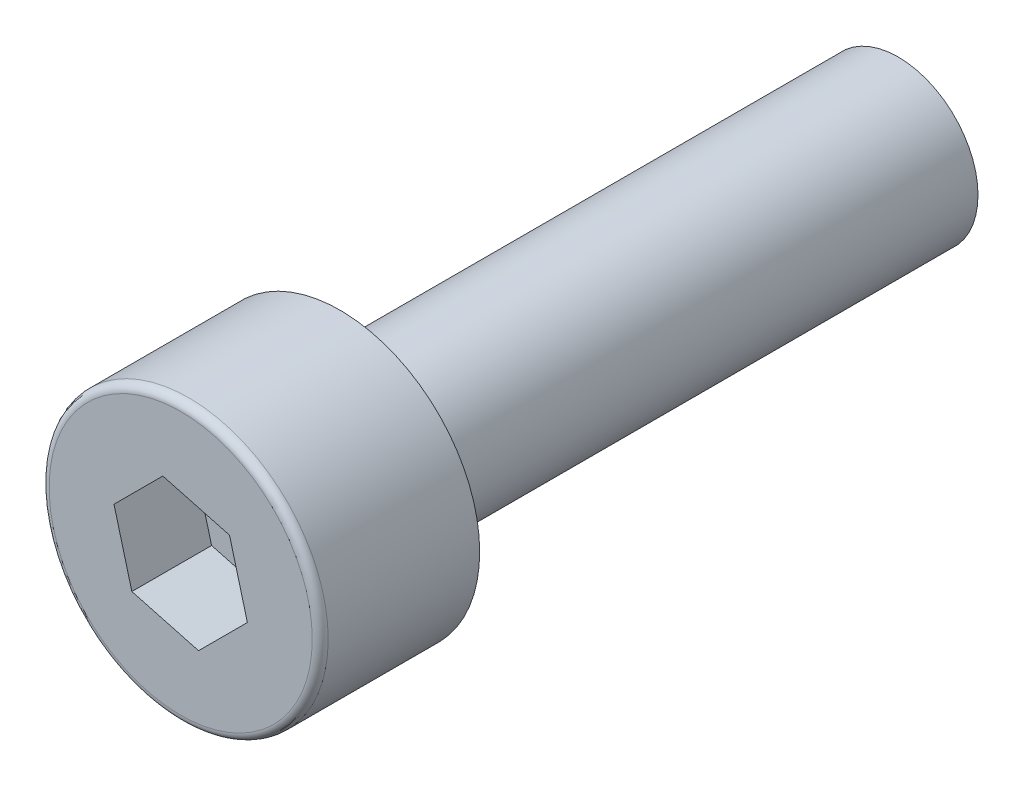
ISO-10303-21;
HEADER;
FILE_DESCRIPTION(('STEP AP214'),'2;1');
FILE_NAME('part.step','',(''),(''),'','','');
FILE_SCHEMA(('AUTOMOTIVE_DESIGN { 1 0 10303 214 1 1 1 1 }'));
ENDSEC;
DATA;
#1=APPLICATION_CONTEXT('core data for automotive mechanical design processes');
#2=APPLICATION_PROTOCOL_DEFINITION('international standard','automotive_design',2000,#1);
#3=PRODUCT_CONTEXT('',#1,'mechanical');
#4=PRODUCT('Part','Part','',(#3));
#5=PRODUCT_RELATED_PRODUCT_CATEGORY('part','',(#4));
#6=PRODUCT_DEFINITION_FORMATION('','',#4);
#7=PRODUCT_DEFINITION_CONTEXT('part definition',#1,'design');
#8=PRODUCT_DEFINITION('design','',#6,#7);
#9=PRODUCT_DEFINITION_SHAPE('','',#8);
#10=(LENGTH_UNIT() NAMED_UNIT(*) SI_UNIT(.MILLI.,.METRE.));
#11=(NAMED_UNIT(*) PLANE_ANGLE_UNIT() SI_UNIT($,.RADIAN.));
#12=(NAMED_UNIT(*) SI_UNIT($,.STERADIAN.) SOLID_ANGLE_UNIT());
#13=UNCERTAINTY_MEASURE_WITH_UNIT(LENGTH_MEASURE(1.E-05),#10,'distance_accuracy_value','');
#14=(GEOMETRIC_REPRESENTATION_CONTEXT(3) GLOBAL_UNCERTAINTY_ASSIGNED_CONTEXT((#13)) GLOBAL_UNIT_ASSIGNED_CONTEXT((#10,
#11,#12)) REPRESENTATION_CONTEXT('',''));
#15=CARTESIAN_POINT('',(0.,0.,0.));
#16=DIRECTION('',(0.,0.,1.));
#17=DIRECTION('',(1.,0.,0.));
#18=AXIS2_PLACEMENT_3D('',#15,#16,#17);
#19=CARTESIAN_POINT('',(0.,0.,0.));
#20=DIRECTION('',(0.,0.,1.));
#21=DIRECTION('',(1.,0.,0.));
#22=AXIS2_PLACEMENT_3D('',#19,#20,#21);
#23=PLANE('',#22);
#24=CARTESIAN_POINT('',(0.,0.,0.));
#25=DIRECTION('',(0.,0.,1.));
#26=DIRECTION('',(1.,0.,0.));
#27=AXIS2_PLACEMENT_3D('',#24,#25,#26);
#28=CIRCLE('',#27,3.5);
#29=CARTESIAN_POINT('',(3.5,0.,0.));
#30=VERTEX_POINT('',#29);
#31=EDGE_CURVE('E138',#30,#30,#28,.T.);
#32=ORIENTED_EDGE('',*,*,#31,.F.);
#33=EDGE_LOOP('',(#32));
#34=FACE_BOUND('',#33,.T.);
#35=CARTESIAN_POINT('',(0.,0.,0.));
#36=DIRECTION('',(0.,0.,1.));
#37=DIRECTION('',(1.,0.,0.));
#38=AXIS2_PLACEMENT_3D('',#35,#36,#37);
#39=CIRCLE('',#38,2.);
#40=CARTESIAN_POINT('',(2.,0.,0.));
#41=VERTEX_POINT('',#40);
#42=EDGE_CURVE('E146',#41,#41,#39,.F.);
#43=ORIENTED_EDGE('',*,*,#42,.F.);
#44=EDGE_LOOP('',(#43));
#45=FACE_BOUND('',#44,.T.);
#46=ADVANCED_FACE('F35',(#34,#45),#23,.F.);
#47=CARTESIAN_POINT('',(0.,0.,4.));
#48=DIRECTION('',(0.,0.,-1.));
#49=DIRECTION('',(-1.,0.,0.));
#50=AXIS2_PLACEMENT_3D('',#47,#48,#49);
#51=CYLINDRICAL_SURFACE('',#50,3.5);
#52=CARTESIAN_POINT('',(0.,0.,3.8));
#53=DIRECTION('',(0.,0.,1.));
#54=DIRECTION('',(1.,0.,0.));
#55=AXIS2_PLACEMENT_3D('',#52,#53,#54);
#56=CIRCLE('',#55,3.5);
#57=CARTESIAN_POINT('',(3.5,0.,3.8));
#58=VERTEX_POINT('',#57);
#59=EDGE_CURVE('E11',#58,#58,#56,.F.);
#60=ORIENTED_EDGE('',*,*,#59,.T.);
#61=EDGE_LOOP('',(#60));
#62=FACE_BOUND('',#61,.T.);
#63=ORIENTED_EDGE('',*,*,#31,.T.);
#64=EDGE_LOOP('',(#63));
#65=FACE_BOUND('',#64,.T.);
#66=ADVANCED_FACE('F165',(#62,#65),#51,.T.);
#67=CARTESIAN_POINT('',(0.,0.,4.));
#68=DIRECTION('',(0.,0.,1.));
#69=DIRECTION('',(1.,0.,0.));
#70=AXIS2_PLACEMENT_3D('',#67,#68,#69);
#71=PLANE('',#70);
#72=CARTESIAN_POINT('',(0.,0.,4.));
#73=DIRECTION('',(0.,0.,1.));
#74=DIRECTION('',(1.,0.,0.));
#75=AXIS2_PLACEMENT_3D('',#72,#73,#74);
#76=CIRCLE('',#75,3.3);
#77=CARTESIAN_POINT('',(3.3,0.,4.));
#78=VERTEX_POINT('',#77);
#79=EDGE_CURVE('E43',#78,#78,#76,.T.);
#80=ORIENTED_EDGE('',*,*,#79,.T.);
#81=EDGE_LOOP('',(#80));
#82=FACE_BOUND('',#81,.T.);
#83=DIRECTION('',(0.258819045102521,-0.965925826289068,0.));
#84=VECTOR('',#83,1.);
#85=CARTESIAN_POINT('',(-1.67303260747562,0.448287736084027,4.));
#86=LINE('',#85,#84);
#87=CARTESIAN_POINT('',(-1.67303260747562,0.448287736084027,4.));
#88=VERTEX_POINT('',#87);
#89=CARTESIAN_POINT('',(-1.22474487139159,-1.22474487139159,4.));
#90=VERTEX_POINT('',#89);
#91=EDGE_CURVE('E50',#88,#90,#86,.T.);
#92=ORIENTED_EDGE('',*,*,#91,.F.);
#93=DIRECTION('',(-0.707106781186547,-0.707106781186548,0.));
#94=VECTOR('',#93,1.);
#95=CARTESIAN_POINT('',(-0.448287736084027,1.67303260747562,4.));
#96=LINE('',#95,#94);
#97=CARTESIAN_POINT('',(-0.448287736084027,1.67303260747562,4.));
#98=VERTEX_POINT('',#97);
#99=EDGE_CURVE('E134',#98,#88,#96,.T.);
#100=ORIENTED_EDGE('',*,*,#99,.F.);
#101=DIRECTION('',(-0.965925826289068,0.258819045102521,0.));
#102=VECTOR('',#101,1.);
#103=CARTESIAN_POINT('',(1.22474487139159,1.22474487139159,4.));
#104=LINE('',#103,#102);
#105=CARTESIAN_POINT('',(1.22474487139159,1.22474487139159,4.));
#106=VERTEX_POINT('',#105);
#107=EDGE_CURVE('E132',#106,#98,#104,.T.);
#108=ORIENTED_EDGE('',*,*,#107,.F.);
#109=DIRECTION('',(-0.258819045102521,0.965925826289068,0.));
#110=VECTOR('',#109,1.);
#111=CARTESIAN_POINT('',(1.67303260747562,-0.448287736084027,4.));
#112=LINE('',#111,#110);
#113=CARTESIAN_POINT('',(1.67303260747562,-0.448287736084027,4.));
#114=VERTEX_POINT('',#113);
#115=EDGE_CURVE('E98',#114,#106,#112,.T.);
#116=ORIENTED_EDGE('',*,*,#115,.F.);
#117=DIRECTION('',(0.707106781186547,0.707106781186548,0.));
#118=VECTOR('',#117,1.);
#119=CARTESIAN_POINT('',(0.448287736084026,-1.67303260747562,4.));
#120=LINE('',#119,#118);
#121=CARTESIAN_POINT('',(0.448287736084026,-1.67303260747562,4.));
#122=VERTEX_POINT('',#121);
#123=EDGE_CURVE('E128',#122,#114,#120,.T.);
#124=ORIENTED_EDGE('',*,*,#123,.F.);
#125=DIRECTION('',(0.965925826289068,-0.258819045102521,0.));
#126=VECTOR('',#125,1.);
#127=CARTESIAN_POINT('',(-1.22474487139159,-1.22474487139159,4.));
#128=LINE('',#127,#126);
#129=EDGE_CURVE('E124',#90,#122,#128,.T.);
#130=ORIENTED_EDGE('',*,*,#129,.F.);
#131=EDGE_LOOP('',(#92,#100,#108,#116,#124,#130));
#132=FACE_BOUND('',#131,.T.);
#133=ADVANCED_FACE('F151',(#82,#132),#71,.T.);
#134=CARTESIAN_POINT('',(-1.67303260747562,0.448287736084027,2.));
#135=DIRECTION('',(-0.965925826289068,-0.258819045102521,0.));
#136=DIRECTION('',(0.258819045102521,-0.965925826289068,0.));
#137=AXIS2_PLACEMENT_3D('',#134,#135,#136);
#138=PLANE('',#137);
#139=ORIENTED_EDGE('',*,*,#91,.T.);
#140=DIRECTION('',(0.,0.,1.));
#141=VECTOR('',#140,1.);
#142=CARTESIAN_POINT('',(-1.22474487139159,-1.22474487139159,2.));
#143=LINE('',#142,#141);
#144=CARTESIAN_POINT('',(-1.22474487139159,-1.22474487139159,2.));
#145=VERTEX_POINT('',#144);
#146=EDGE_CURVE('E80',#145,#90,#143,.T.);
#147=ORIENTED_EDGE('',*,*,#146,.F.);
#148=DIRECTION('',(0.258819045102521,-0.965925826289068,0.));
#149=VECTOR('',#148,1.);
#150=CARTESIAN_POINT('',(-1.67303260747562,0.448287736084027,2.));
#151=LINE('',#150,#149);
#152=CARTESIAN_POINT('',(-1.67303260747562,0.448287736084027,2.));
#153=VERTEX_POINT('',#152);
#154=EDGE_CURVE('E136',#153,#145,#151,.T.);
#155=ORIENTED_EDGE('',*,*,#154,.F.);
#156=DIRECTION('',(0.,0.,1.));
#157=VECTOR('',#156,1.);
#158=CARTESIAN_POINT('',(-1.67303260747562,0.448287736084027,2.));
#159=LINE('',#158,#157);
#160=EDGE_CURVE('E58',#153,#88,#159,.T.);
#161=ORIENTED_EDGE('',*,*,#160,.T.);
#162=EDGE_LOOP('',(#139,#147,#155,#161));
#163=FACE_BOUND('',#162,.T.);
#164=ADVANCED_FACE('F177',(#163),#138,.F.);
#165=CARTESIAN_POINT('',(-0.448287736084027,1.67303260747562,2.));
#166=DIRECTION('',(-0.707106781186548,0.707106781186547,0.));
#167=DIRECTION('',(-0.707106781186547,-0.707106781186548,0.));
#168=AXIS2_PLACEMENT_3D('',#165,#166,#167);
#169=PLANE('',#168);
#170=ORIENTED_EDGE('',*,*,#99,.T.);
#171=ORIENTED_EDGE('',*,*,#160,.F.);
#172=DIRECTION('',(-0.707106781186547,-0.707106781186548,0.));
#173=VECTOR('',#172,1.);
#174=CARTESIAN_POINT('',(-0.448287736084027,1.67303260747562,2.));
#175=LINE('',#174,#173);
#176=CARTESIAN_POINT('',(-0.448287736084027,1.67303260747562,2.));
#177=VERTEX_POINT('',#176);
#178=EDGE_CURVE('E110',#177,#153,#175,.T.);
#179=ORIENTED_EDGE('',*,*,#178,.F.);
#180=DIRECTION('',(0.,0.,1.));
#181=VECTOR('',#180,1.);
#182=CARTESIAN_POINT('',(-0.448287736084027,1.67303260747562,2.));
#183=LINE('',#182,#181);
#184=EDGE_CURVE('E102',#177,#98,#183,.T.);
#185=ORIENTED_EDGE('',*,*,#184,.T.);
#186=EDGE_LOOP('',(#170,#171,#179,#185));
#187=FACE_BOUND('',#186,.T.);
#188=ADVANCED_FACE('F180',(#187),#169,.F.);
#189=CARTESIAN_POINT('',(1.22474487139159,1.22474487139159,2.));
#190=DIRECTION('',(0.258819045102521,0.965925826289068,0.));
#191=DIRECTION('',(-0.965925826289068,0.258819045102521,0.));
#192=AXIS2_PLACEMENT_3D('',#189,#190,#191);
#193=PLANE('',#192);
#194=ORIENTED_EDGE('',*,*,#107,.T.);
#195=ORIENTED_EDGE('',*,*,#184,.F.);
#196=DIRECTION('',(-0.965925826289068,0.258819045102521,0.));
#197=VECTOR('',#196,1.);
#198=CARTESIAN_POINT('',(1.22474487139159,1.22474487139159,2.));
#199=LINE('',#198,#197);
#200=CARTESIAN_POINT('',(1.22474487139159,1.22474487139159,2.));
#201=VERTEX_POINT('',#200);
#202=EDGE_CURVE('E106',#201,#177,#199,.T.);
#203=ORIENTED_EDGE('',*,*,#202,.F.);
#204=DIRECTION('',(0.,0.,1.));
#205=VECTOR('',#204,1.);
#206=CARTESIAN_POINT('',(1.22474487139159,1.22474487139159,2.));
#207=LINE('',#206,#205);
#208=EDGE_CURVE('E91',#201,#106,#207,.T.);
#209=ORIENTED_EDGE('',*,*,#208,.T.);
#210=EDGE_LOOP('',(#194,#195,#203,#209));
#211=FACE_BOUND('',#210,.T.);
#212=ADVANCED_FACE('F107',(#211),#193,.F.);
#213=CARTESIAN_POINT('',(1.67303260747562,-0.448287736084027,2.));
#214=DIRECTION('',(0.965925826289068,0.258819045102521,0.));
#215=DIRECTION('',(-0.258819045102521,0.965925826289068,0.));
#216=AXIS2_PLACEMENT_3D('',#213,#214,#215);
#217=PLANE('',#216);
#218=ORIENTED_EDGE('',*,*,#115,.T.);
#219=ORIENTED_EDGE('',*,*,#208,.F.);
#220=DIRECTION('',(-0.258819045102521,0.965925826289068,0.));
#221=VECTOR('',#220,1.);
#222=CARTESIAN_POINT('',(1.67303260747562,-0.448287736084027,2.));
#223=LINE('',#222,#221);
#224=CARTESIAN_POINT('',(1.67303260747562,-0.448287736084027,2.));
#225=VERTEX_POINT('',#224);
#226=EDGE_CURVE('E95',#225,#201,#223,.T.);
#227=ORIENTED_EDGE('',*,*,#226,.F.);
#228=DIRECTION('',(0.,0.,1.));
#229=VECTOR('',#228,1.);
#230=CARTESIAN_POINT('',(1.67303260747562,-0.448287736084027,2.));
#231=LINE('',#230,#229);
#232=EDGE_CURVE('E103',#225,#114,#231,.T.);
#233=ORIENTED_EDGE('',*,*,#232,.T.);
#234=EDGE_LOOP('',(#218,#219,#227,#233));
#235=FACE_BOUND('',#234,.T.);
#236=ADVANCED_FACE('F93',(#235),#217,.F.);
#237=CARTESIAN_POINT('',(0.448287736084026,-1.67303260747562,2.));
#238=DIRECTION('',(0.707106781186548,-0.707106781186547,0.));
#239=DIRECTION('',(0.707106781186547,0.707106781186548,0.));
#240=AXIS2_PLACEMENT_3D('',#237,#238,#239);
#241=PLANE('',#240);
#242=ORIENTED_EDGE('',*,*,#123,.T.);
#243=ORIENTED_EDGE('',*,*,#232,.F.);
#244=DIRECTION('',(0.707106781186547,0.707106781186548,0.));
#245=VECTOR('',#244,1.);
#246=CARTESIAN_POINT('',(0.448287736084026,-1.67303260747562,2.));
#247=LINE('',#246,#245);
#248=CARTESIAN_POINT('',(0.448287736084026,-1.67303260747562,2.));
#249=VERTEX_POINT('',#248);
#250=EDGE_CURVE('E116',#249,#225,#247,.T.);
#251=ORIENTED_EDGE('',*,*,#250,.F.);
#252=DIRECTION('',(0.,0.,1.));
#253=VECTOR('',#252,1.);
#254=CARTESIAN_POINT('',(0.448287736084026,-1.67303260747562,2.));
#255=LINE('',#254,#253);
#256=EDGE_CURVE('E141',#249,#122,#255,.T.);
#257=ORIENTED_EDGE('',*,*,#256,.T.);
#258=EDGE_LOOP('',(#242,#243,#251,#257));
#259=FACE_BOUND('',#258,.T.);
#260=ADVANCED_FACE('F184',(#259),#241,.F.);
#261=CARTESIAN_POINT('',(-1.22474487139159,-1.22474487139159,2.));
#262=DIRECTION('',(-0.258819045102521,-0.965925826289068,0.));
#263=DIRECTION('',(0.965925826289068,-0.258819045102521,0.));
#264=AXIS2_PLACEMENT_3D('',#261,#262,#263);
#265=PLANE('',#264);
#266=ORIENTED_EDGE('',*,*,#129,.T.);
#267=ORIENTED_EDGE('',*,*,#256,.F.);
#268=DIRECTION('',(0.965925826289068,-0.258819045102521,0.));
#269=VECTOR('',#268,1.);
#270=CARTESIAN_POINT('',(-1.22474487139159,-1.22474487139159,2.));
#271=LINE('',#270,#269);
#272=EDGE_CURVE('E118',#145,#249,#271,.T.);
#273=ORIENTED_EDGE('',*,*,#272,.F.);
#274=ORIENTED_EDGE('',*,*,#146,.T.);
#275=EDGE_LOOP('',(#266,#267,#273,#274));
#276=FACE_BOUND('',#275,.T.);
#277=ADVANCED_FACE('F181',(#276),#265,.F.);
#278=CARTESIAN_POINT('',(0.,0.,2.));
#279=DIRECTION('',(0.,0.,1.));
#280=DIRECTION('',(1.,0.,0.));
#281=AXIS2_PLACEMENT_3D('',#278,#279,#280);
#282=PLANE('',#281);
#283=ORIENTED_EDGE('',*,*,#154,.T.);
#284=ORIENTED_EDGE('',*,*,#272,.T.);
#285=ORIENTED_EDGE('',*,*,#250,.T.);
#286=ORIENTED_EDGE('',*,*,#226,.T.);
#287=ORIENTED_EDGE('',*,*,#202,.T.);
#288=ORIENTED_EDGE('',*,*,#178,.T.);
#289=EDGE_LOOP('',(#283,#284,#285,#286,#287,#288));
#290=FACE_BOUND('',#289,.T.);
#291=ADVANCED_FACE('F113',(#290),#282,.T.);
#292=CARTESIAN_POINT('',(0.,0.,-14.));
#293=DIRECTION('',(0.,0.,1.));
#294=DIRECTION('',(1.,0.,0.));
#295=AXIS2_PLACEMENT_3D('',#292,#293,#294);
#296=CYLINDRICAL_SURFACE('',#295,2.);
#297=CARTESIAN_POINT('',(0.,0.,-14.));
#298=DIRECTION('',(0.,0.,-1.));
#299=DIRECTION('',(-1.,0.,0.));
#300=AXIS2_PLACEMENT_3D('',#297,#298,#299);
#301=CIRCLE('',#300,2.);
#302=CARTESIAN_POINT('',(-2.,0.,-14.));
#303=VERTEX_POINT('',#302);
#304=EDGE_CURVE('E125',#303,#303,#301,.T.);
#305=ORIENTED_EDGE('',*,*,#304,.F.);
#306=EDGE_LOOP('',(#305));
#307=FACE_BOUND('',#306,.T.);
#308=ORIENTED_EDGE('',*,*,#42,.T.);
#309=EDGE_LOOP('',(#308));
#310=FACE_BOUND('',#309,.T.);
#311=ADVANCED_FACE('F160',(#307,#310),#296,.T.);
#312=CARTESIAN_POINT('',(0.,0.,-14.));
#313=DIRECTION('',(0.,0.,-1.));
#314=DIRECTION('',(-1.,0.,0.));
#315=AXIS2_PLACEMENT_3D('',#312,#313,#314);
#316=PLANE('',#315);
#317=ORIENTED_EDGE('',*,*,#304,.T.);
#318=EDGE_LOOP('',(#317));
#319=FACE_BOUND('',#318,.T.);
#320=ADVANCED_FACE('F155',(#319),#316,.T.);
#321=CARTESIAN_POINT('',(0.,0.,3.8));
#322=DIRECTION('',(0.,0.,1.));
#323=DIRECTION('',(1.,0.,0.));
#324=AXIS2_PLACEMENT_3D('',#321,#322,#323);
#325=TOROIDAL_SURFACE('',#324,3.3,0.2);
#326=ORIENTED_EDGE('',*,*,#59,.F.);
#327=EDGE_LOOP('',(#326));
#328=FACE_BOUND('',#327,.T.);
#329=ORIENTED_EDGE('',*,*,#79,.F.);
#330=EDGE_LOOP('',(#329));
#331=FACE_BOUND('',#330,.T.);
#332=ADVANCED_FACE('F37',(#328,#331),#325,.T.);
#333=CLOSED_SHELL('',(#46,#66,#133,#164,#188,#212,#236,#260,#277,#291,#311,#320,#332));
#334=MANIFOLD_SOLID_BREP('B2',#333);
#335=ADVANCED_BREP_SHAPE_REPRESENTATION('',(#18,#334),#14);
#336=SHAPE_DEFINITION_REPRESENTATION(#9,#335);
ENDSEC;
END-ISO-10303-21;
